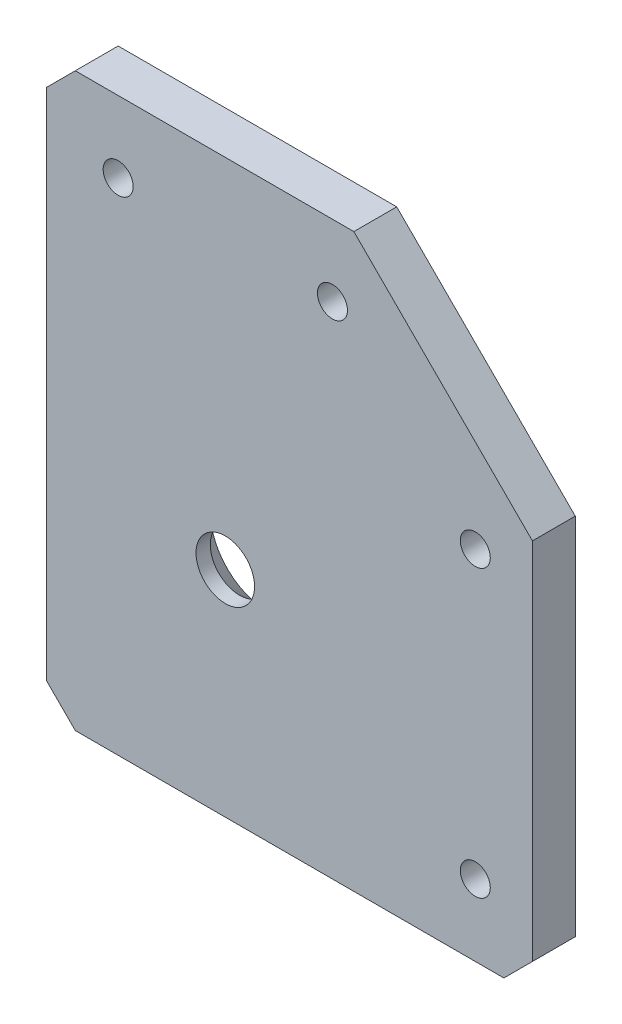
ISO-10303-21;
HEADER;
FILE_DESCRIPTION(('STEP AP214'),'2;1');
FILE_NAME('part.step','',(''),(''),'','','');
FILE_SCHEMA(('AUTOMOTIVE_DESIGN { 1 0 10303 214 1 1 1 1 }'));
ENDSEC;
DATA;
#1=APPLICATION_CONTEXT('core data for automotive mechanical design processes');
#2=APPLICATION_PROTOCOL_DEFINITION('international standard','automotive_design',2000,#1);
#3=PRODUCT_CONTEXT('',#1,'mechanical');
#4=PRODUCT('Part','Part','',(#3));
#5=PRODUCT_RELATED_PRODUCT_CATEGORY('part','',(#4));
#6=PRODUCT_DEFINITION_FORMATION('','',#4);
#7=PRODUCT_DEFINITION_CONTEXT('part definition',#1,'design');
#8=PRODUCT_DEFINITION('design','',#6,#7);
#9=PRODUCT_DEFINITION_SHAPE('','',#8);
#10=(LENGTH_UNIT() NAMED_UNIT(*) SI_UNIT(.MILLI.,.METRE.));
#11=(NAMED_UNIT(*) PLANE_ANGLE_UNIT() SI_UNIT($,.RADIAN.));
#12=(NAMED_UNIT(*) SI_UNIT($,.STERADIAN.) SOLID_ANGLE_UNIT());
#13=UNCERTAINTY_MEASURE_WITH_UNIT(LENGTH_MEASURE(1.E-05),#10,'distance_accuracy_value','');
#14=(GEOMETRIC_REPRESENTATION_CONTEXT(3) GLOBAL_UNCERTAINTY_ASSIGNED_CONTEXT((#13)) GLOBAL_UNIT_ASSIGNED_CONTEXT((#10,
#11,#12)) REPRESENTATION_CONTEXT('',''));
#15=CARTESIAN_POINT('',(0.,0.,0.));
#16=DIRECTION('',(0.,0.,1.));
#17=DIRECTION('',(1.,0.,0.));
#18=AXIS2_PLACEMENT_3D('',#15,#16,#17);
#19=CARTESIAN_POINT('',(0.,0.,3.));
#20=DIRECTION('',(0.,0.,1.));
#21=DIRECTION('',(1.,0.,0.));
#22=AXIS2_PLACEMENT_3D('',#19,#20,#21);
#23=PLANE('',#22);
#24=CARTESIAN_POINT('',(-15.,40.,3.));
#25=DIRECTION('',(0.,0.,1.));
#26=DIRECTION('',(1.,0.,0.));
#27=AXIS2_PLACEMENT_3D('',#24,#25,#26);
#28=CIRCLE('',#27,2.1);
#29=CARTESIAN_POINT('',(-12.9,40.,3.));
#30=VERTEX_POINT('',#29);
#31=EDGE_CURVE('E302',#30,#30,#28,.T.);
#32=ORIENTED_EDGE('',*,*,#31,.F.);
#33=EDGE_LOOP('',(#32));
#34=FACE_BOUND('',#33,.T.);
#35=CARTESIAN_POINT('',(35.,20.,3.));
#36=DIRECTION('',(0.,0.,1.));
#37=DIRECTION('',(1.,0.,0.));
#38=AXIS2_PLACEMENT_3D('',#35,#36,#37);
#39=CIRCLE('',#38,2.1);
#40=CARTESIAN_POINT('',(37.1,20.,3.));
#41=VERTEX_POINT('',#40);
#42=EDGE_CURVE('E294',#41,#41,#39,.T.);
#43=ORIENTED_EDGE('',*,*,#42,.F.);
#44=EDGE_LOOP('',(#43));
#45=FACE_BOUND('',#44,.T.);
#46=DIRECTION('',(-1.,0.,0.));
#47=VECTOR('',#46,1.);
#48=CARTESIAN_POINT('',(43.,50.,3.));
#49=LINE('',#48,#47);
#50=CARTESIAN_POINT('',(18.,50.,3.));
#51=VERTEX_POINT('',#50);
#52=CARTESIAN_POINT('',(-21.,50.,3.));
#53=VERTEX_POINT('',#52);
#54=EDGE_CURVE('E124',#51,#53,#49,.T.);
#55=ORIENTED_EDGE('',*,*,#54,.T.);
#56=DIRECTION('',(0.707106781186547,0.707106781186548,0.));
#57=VECTOR('',#56,1.);
#58=CARTESIAN_POINT('',(-35.5,35.5,3.));
#59=LINE('',#58,#57);
#60=CARTESIAN_POINT('',(-25.,46.,3.));
#61=VERTEX_POINT('',#60);
#62=EDGE_CURVE('E162',#53,#61,#59,.F.);
#63=ORIENTED_EDGE('',*,*,#62,.T.);
#64=DIRECTION('',(0.,-1.,0.));
#65=VECTOR('',#64,1.);
#66=CARTESIAN_POINT('',(-25.,-30.,3.));
#67=LINE('',#66,#65);
#68=CARTESIAN_POINT('',(-25.,-26.,3.));
#69=VERTEX_POINT('',#68);
#70=EDGE_CURVE('E129',#61,#69,#67,.T.);
#71=ORIENTED_EDGE('',*,*,#70,.T.);
#72=DIRECTION('',(-0.707106781186546,0.707106781186549,0.));
#73=VECTOR('',#72,1.);
#74=CARTESIAN_POINT('',(-25.5000000000001,-25.5,3.));
#75=LINE('',#74,#73);
#76=CARTESIAN_POINT('',(-21.,-30.,3.));
#77=VERTEX_POINT('',#76);
#78=EDGE_CURVE('E60',#69,#77,#75,.F.);
#79=ORIENTED_EDGE('',*,*,#78,.T.);
#80=DIRECTION('',(1.,0.,0.));
#81=VECTOR('',#80,1.);
#82=CARTESIAN_POINT('',(43.,-30.,3.));
#83=LINE('',#82,#81);
#84=CARTESIAN_POINT('',(39.,-30.,3.));
#85=VERTEX_POINT('',#84);
#86=EDGE_CURVE('E132',#77,#85,#83,.T.);
#87=ORIENTED_EDGE('',*,*,#86,.T.);
#88=DIRECTION('',(-0.70710678118655,-0.707106781186545,0.));
#89=VECTOR('',#88,1.);
#90=CARTESIAN_POINT('',(34.4999999999999,-34.5000000000001,3.));
#91=LINE('',#90,#89);
#92=CARTESIAN_POINT('',(43.,-26.,3.));
#93=VERTEX_POINT('',#92);
#94=EDGE_CURVE('E160',#85,#93,#91,.F.);
#95=ORIENTED_EDGE('',*,*,#94,.T.);
#96=DIRECTION('',(0.,1.,0.));
#97=VECTOR('',#96,1.);
#98=CARTESIAN_POINT('',(43.,-30.,3.));
#99=LINE('',#98,#97);
#100=CARTESIAN_POINT('',(43.,24.9999999999999,3.));
#101=VERTEX_POINT('',#100);
#102=EDGE_CURVE('E307',#93,#101,#99,.T.);
#103=ORIENTED_EDGE('',*,*,#102,.T.);
#104=DIRECTION('',(0.707106781186547,-0.707106781186548,0.));
#105=VECTOR('',#104,1.);
#106=CARTESIAN_POINT('',(34.,33.9999999999999,3.));
#107=LINE('',#106,#105);
#108=EDGE_CURVE('E139',#101,#51,#107,.F.);
#109=ORIENTED_EDGE('',*,*,#108,.T.);
#110=EDGE_LOOP('',(#55,#63,#71,#79,#87,#95,#103,#109));
#111=FACE_BOUND('',#110,.T.);
#112=CARTESIAN_POINT('',(0.,0.,3.));
#113=DIRECTION('',(0.,0.,1.));
#114=DIRECTION('',(1.,0.,0.));
#115=AXIS2_PLACEMENT_3D('',#112,#113,#114);
#116=CIRCLE('',#115,4.1);
#117=CARTESIAN_POINT('',(4.1,0.,3.));
#118=VERTEX_POINT('',#117);
#119=EDGE_CURVE('E295',#118,#118,#116,.T.);
#120=ORIENTED_EDGE('',*,*,#119,.F.);
#121=EDGE_LOOP('',(#120));
#122=FACE_BOUND('',#121,.T.);
#123=CARTESIAN_POINT('',(35.,-20.,3.));
#124=DIRECTION('',(0.,0.,1.));
#125=DIRECTION('',(1.,0.,0.));
#126=AXIS2_PLACEMENT_3D('',#123,#124,#125);
#127=CIRCLE('',#126,2.1);
#128=CARTESIAN_POINT('',(37.1,-20.,3.));
#129=VERTEX_POINT('',#128);
#130=EDGE_CURVE('E296',#129,#129,#127,.T.);
#131=ORIENTED_EDGE('',*,*,#130,.F.);
#132=EDGE_LOOP('',(#131));
#133=FACE_BOUND('',#132,.T.);
#134=CARTESIAN_POINT('',(15.,40.,3.));
#135=DIRECTION('',(0.,0.,1.));
#136=DIRECTION('',(1.,0.,0.));
#137=AXIS2_PLACEMENT_3D('',#134,#135,#136);
#138=CIRCLE('',#137,2.1);
#139=CARTESIAN_POINT('',(17.1,40.,3.));
#140=VERTEX_POINT('',#139);
#141=EDGE_CURVE('E449',#140,#140,#138,.T.);
#142=ORIENTED_EDGE('',*,*,#141,.F.);
#143=EDGE_LOOP('',(#142));
#144=FACE_BOUND('',#143,.T.);
#145=ADVANCED_FACE('F37',(#34,#45,#111,#122,#133,#144),#23,.T.);
#146=CARTESIAN_POINT('',(0.,0.,-3.));
#147=DIRECTION('',(0.,0.,1.));
#148=DIRECTION('',(1.,0.,0.));
#149=AXIS2_PLACEMENT_3D('',#146,#147,#148);
#150=PLANE('',#149);
#151=CARTESIAN_POINT('',(35.,-20.,-3.));
#152=DIRECTION('',(0.,0.,1.));
#153=DIRECTION('',(1.,0.,0.));
#154=AXIS2_PLACEMENT_3D('',#151,#152,#153);
#155=CIRCLE('',#154,4.09999999999998);
#156=CARTESIAN_POINT('',(39.1,-20.,-3.));
#157=VERTEX_POINT('',#156);
#158=EDGE_CURVE('E180',#157,#157,#155,.T.);
#159=ORIENTED_EDGE('',*,*,#158,.T.);
#160=EDGE_LOOP('',(#159));
#161=FACE_BOUND('',#160,.T.);
#162=CARTESIAN_POINT('',(35.,20.,-3.));
#163=DIRECTION('',(0.,0.,1.));
#164=DIRECTION('',(1.,0.,0.));
#165=AXIS2_PLACEMENT_3D('',#162,#163,#164);
#166=CIRCLE('',#165,4.09999999999998);
#167=CARTESIAN_POINT('',(39.1,20.,-3.));
#168=VERTEX_POINT('',#167);
#169=EDGE_CURVE('E177',#168,#168,#166,.T.);
#170=ORIENTED_EDGE('',*,*,#169,.T.);
#171=EDGE_LOOP('',(#170));
#172=FACE_BOUND('',#171,.T.);
#173=CARTESIAN_POINT('',(15.,40.,-3.));
#174=DIRECTION('',(0.,0.,1.));
#175=DIRECTION('',(1.,0.,0.));
#176=AXIS2_PLACEMENT_3D('',#173,#174,#175);
#177=CIRCLE('',#176,4.09999999999998);
#178=CARTESIAN_POINT('',(19.1,40.,-3.));
#179=VERTEX_POINT('',#178);
#180=EDGE_CURVE('E174',#179,#179,#177,.T.);
#181=ORIENTED_EDGE('',*,*,#180,.T.);
#182=EDGE_LOOP('',(#181));
#183=FACE_BOUND('',#182,.T.);
#184=CARTESIAN_POINT('',(-15.,40.,-3.));
#185=DIRECTION('',(0.,0.,1.));
#186=DIRECTION('',(1.,0.,0.));
#187=AXIS2_PLACEMENT_3D('',#184,#185,#186);
#188=CIRCLE('',#187,4.09999999999998);
#189=CARTESIAN_POINT('',(-10.9,40.,-3.));
#190=VERTEX_POINT('',#189);
#191=EDGE_CURVE('E171',#190,#190,#188,.T.);
#192=ORIENTED_EDGE('',*,*,#191,.T.);
#193=EDGE_LOOP('',(#192));
#194=FACE_BOUND('',#193,.T.);
#195=CARTESIAN_POINT('',(0.,0.,-3.));
#196=DIRECTION('',(0.,0.,1.));
#197=DIRECTION('',(1.,0.,0.));
#198=AXIS2_PLACEMENT_3D('',#195,#196,#197);
#199=CIRCLE('',#198,8.1);
#200=CARTESIAN_POINT('',(8.1,0.,-3.));
#201=VERTEX_POINT('',#200);
#202=EDGE_CURVE('E146',#201,#201,#199,.T.);
#203=ORIENTED_EDGE('',*,*,#202,.T.);
#204=EDGE_LOOP('',(#203));
#205=FACE_BOUND('',#204,.T.);
#206=DIRECTION('',(0.,-1.,0.));
#207=VECTOR('',#206,1.);
#208=CARTESIAN_POINT('',(-25.,-30.,-3.));
#209=LINE('',#208,#207);
#210=CARTESIAN_POINT('',(-25.,46.,-3.));
#211=VERTEX_POINT('',#210);
#212=CARTESIAN_POINT('',(-25.,-26.,-3.));
#213=VERTEX_POINT('',#212);
#214=EDGE_CURVE('E299',#211,#213,#209,.T.);
#215=ORIENTED_EDGE('',*,*,#214,.F.);
#216=DIRECTION('',(-0.707106781186547,-0.707106781186548,0.));
#217=VECTOR('',#216,1.);
#218=CARTESIAN_POINT('',(-25.,46.,-3.));
#219=LINE('',#218,#217);
#220=CARTESIAN_POINT('',(-21.,50.,-3.));
#221=VERTEX_POINT('',#220);
#222=EDGE_CURVE('E128',#211,#221,#219,.F.);
#223=ORIENTED_EDGE('',*,*,#222,.T.);
#224=DIRECTION('',(-1.,0.,0.));
#225=VECTOR('',#224,1.);
#226=CARTESIAN_POINT('',(43.,50.,-3.));
#227=LINE('',#226,#225);
#228=CARTESIAN_POINT('',(18.,50.,-3.));
#229=VERTEX_POINT('',#228);
#230=EDGE_CURVE('E121',#229,#221,#227,.T.);
#231=ORIENTED_EDGE('',*,*,#230,.F.);
#232=DIRECTION('',(-0.707106781186547,0.707106781186548,0.));
#233=VECTOR('',#232,1.);
#234=CARTESIAN_POINT('',(18.,50.,-3.));
#235=LINE('',#234,#233);
#236=CARTESIAN_POINT('',(43.,24.9999999999999,-3.));
#237=VERTEX_POINT('',#236);
#238=EDGE_CURVE('E106',#229,#237,#235,.F.);
#239=ORIENTED_EDGE('',*,*,#238,.T.);
#240=DIRECTION('',(0.,1.,0.));
#241=VECTOR('',#240,1.);
#242=CARTESIAN_POINT('',(43.,-30.,-3.));
#243=LINE('',#242,#241);
#244=CARTESIAN_POINT('',(43.,-26.,-3.));
#245=VERTEX_POINT('',#244);
#246=EDGE_CURVE('E130',#245,#237,#243,.T.);
#247=ORIENTED_EDGE('',*,*,#246,.F.);
#248=DIRECTION('',(0.70710678118655,0.707106781186545,0.));
#249=VECTOR('',#248,1.);
#250=CARTESIAN_POINT('',(43.,-26.,-3.));
#251=LINE('',#250,#249);
#252=CARTESIAN_POINT('',(39.,-30.,-3.));
#253=VERTEX_POINT('',#252);
#254=EDGE_CURVE('E143',#245,#253,#251,.F.);
#255=ORIENTED_EDGE('',*,*,#254,.T.);
#256=DIRECTION('',(1.,0.,0.));
#257=VECTOR('',#256,1.);
#258=CARTESIAN_POINT('',(43.,-30.,-3.));
#259=LINE('',#258,#257);
#260=CARTESIAN_POINT('',(-21.,-30.,-3.));
#261=VERTEX_POINT('',#260);
#262=EDGE_CURVE('E134',#261,#253,#259,.T.);
#263=ORIENTED_EDGE('',*,*,#262,.F.);
#264=DIRECTION('',(0.707106781186546,-0.707106781186549,0.));
#265=VECTOR('',#264,1.);
#266=CARTESIAN_POINT('',(-21.,-30.,-3.));
#267=LINE('',#266,#265);
#268=EDGE_CURVE('E141',#261,#213,#267,.F.);
#269=ORIENTED_EDGE('',*,*,#268,.T.);
#270=EDGE_LOOP('',(#215,#223,#231,#239,#247,#255,#263,#269));
#271=FACE_BOUND('',#270,.T.);
#272=ADVANCED_FACE('F127',(#161,#172,#183,#194,#205,#271),#150,.F.);
#273=CARTESIAN_POINT('',(-25.,-30.,3.));
#274=DIRECTION('',(1.,0.,0.));
#275=DIRECTION('',(0.,1.,0.));
#276=AXIS2_PLACEMENT_3D('',#273,#274,#275);
#277=PLANE('',#276);
#278=ORIENTED_EDGE('',*,*,#70,.F.);
#279=DIRECTION('',(0.,0.,-1.));
#280=VECTOR('',#279,1.);
#281=CARTESIAN_POINT('',(-25.,46.,3.));
#282=LINE('',#281,#280);
#283=EDGE_CURVE('E154',#61,#211,#282,.T.);
#284=ORIENTED_EDGE('',*,*,#283,.T.);
#285=ORIENTED_EDGE('',*,*,#214,.T.);
#286=DIRECTION('',(0.,0.,1.));
#287=VECTOR('',#286,1.);
#288=CARTESIAN_POINT('',(-25.,-26.,3.));
#289=LINE('',#288,#287);
#290=EDGE_CURVE('E152',#213,#69,#289,.T.);
#291=ORIENTED_EDGE('',*,*,#290,.T.);
#292=EDGE_LOOP('',(#278,#284,#285,#291));
#293=FACE_BOUND('',#292,.T.);
#294=ADVANCED_FACE('F202',(#293),#277,.F.);
#295=CARTESIAN_POINT('',(43.,-30.,3.));
#296=DIRECTION('',(0.,1.,0.));
#297=DIRECTION('',(-1.,0.,0.));
#298=AXIS2_PLACEMENT_3D('',#295,#296,#297);
#299=PLANE('',#298);
#300=ORIENTED_EDGE('',*,*,#262,.T.);
#301=DIRECTION('',(0.,0.,1.));
#302=VECTOR('',#301,1.);
#303=CARTESIAN_POINT('',(39.,-30.,3.));
#304=LINE('',#303,#302);
#305=EDGE_CURVE('E53',#253,#85,#304,.T.);
#306=ORIENTED_EDGE('',*,*,#305,.T.);
#307=ORIENTED_EDGE('',*,*,#86,.F.);
#308=DIRECTION('',(0.,0.,-1.));
#309=VECTOR('',#308,1.);
#310=CARTESIAN_POINT('',(-21.,-30.,3.));
#311=LINE('',#310,#309);
#312=EDGE_CURVE('E167',#77,#261,#311,.T.);
#313=ORIENTED_EDGE('',*,*,#312,.T.);
#314=EDGE_LOOP('',(#300,#306,#307,#313));
#315=FACE_BOUND('',#314,.T.);
#316=ADVANCED_FACE('F240',(#315),#299,.F.);
#317=CARTESIAN_POINT('',(43.,-30.,3.));
#318=DIRECTION('',(-1.,0.,0.));
#319=DIRECTION('',(0.,-1.,0.));
#320=AXIS2_PLACEMENT_3D('',#317,#318,#319);
#321=PLANE('',#320);
#322=ORIENTED_EDGE('',*,*,#102,.F.);
#323=DIRECTION('',(0.,0.,-1.));
#324=VECTOR('',#323,1.);
#325=CARTESIAN_POINT('',(43.,-26.,3.));
#326=LINE('',#325,#324);
#327=EDGE_CURVE('E164',#93,#245,#326,.T.);
#328=ORIENTED_EDGE('',*,*,#327,.T.);
#329=ORIENTED_EDGE('',*,*,#246,.T.);
#330=DIRECTION('',(0.,0.,1.));
#331=VECTOR('',#330,1.);
#332=CARTESIAN_POINT('',(43.,24.9999999999999,3.));
#333=LINE('',#332,#331);
#334=EDGE_CURVE('E112',#237,#101,#333,.T.);
#335=ORIENTED_EDGE('',*,*,#334,.T.);
#336=EDGE_LOOP('',(#322,#328,#329,#335));
#337=FACE_BOUND('',#336,.T.);
#338=ADVANCED_FACE('F237',(#337),#321,.F.);
#339=CARTESIAN_POINT('',(43.,50.,3.));
#340=DIRECTION('',(0.,-1.,0.));
#341=DIRECTION('',(1.,0.,0.));
#342=AXIS2_PLACEMENT_3D('',#339,#340,#341);
#343=PLANE('',#342);
#344=ORIENTED_EDGE('',*,*,#230,.T.);
#345=DIRECTION('',(0.,0.,1.));
#346=VECTOR('',#345,1.);
#347=CARTESIAN_POINT('',(-21.,50.,3.));
#348=LINE('',#347,#346);
#349=EDGE_CURVE('E157',#221,#53,#348,.T.);
#350=ORIENTED_EDGE('',*,*,#349,.T.);
#351=ORIENTED_EDGE('',*,*,#54,.F.);
#352=DIRECTION('',(0.,0.,-1.));
#353=VECTOR('',#352,1.);
#354=CARTESIAN_POINT('',(18.,50.,3.));
#355=LINE('',#354,#353);
#356=EDGE_CURVE('E110',#51,#229,#355,.T.);
#357=ORIENTED_EDGE('',*,*,#356,.T.);
#358=EDGE_LOOP('',(#344,#350,#351,#357));
#359=FACE_BOUND('',#358,.T.);
#360=ADVANCED_FACE('F120',(#359),#343,.F.);
#361=CARTESIAN_POINT('',(0.,0.,3.));
#362=DIRECTION('',(0.,0.,-1.));
#363=DIRECTION('',(-1.,0.,0.));
#364=AXIS2_PLACEMENT_3D('',#361,#362,#363);
#365=CYLINDRICAL_SURFACE('',#364,4.1);
#366=CARTESIAN_POINT('',(0.,0.,1.00000000000001));
#367=DIRECTION('',(0.,0.,1.));
#368=DIRECTION('',(1.,0.,0.));
#369=AXIS2_PLACEMENT_3D('',#366,#367,#368);
#370=CIRCLE('',#369,4.1);
#371=CARTESIAN_POINT('',(4.1,0.,1.00000000000001));
#372=VERTEX_POINT('',#371);
#373=EDGE_CURVE('E149',#372,#372,#370,.F.);
#374=ORIENTED_EDGE('',*,*,#373,.T.);
#375=EDGE_LOOP('',(#374));
#376=FACE_BOUND('',#375,.T.);
#377=ORIENTED_EDGE('',*,*,#119,.T.);
#378=EDGE_LOOP('',(#377));
#379=FACE_BOUND('',#378,.T.);
#380=ADVANCED_FACE('F232',(#376,#379),#365,.F.);
#381=CARTESIAN_POINT('',(35.,20.,3.));
#382=DIRECTION('',(0.,0.,-1.));
#383=DIRECTION('',(-1.,0.,0.));
#384=AXIS2_PLACEMENT_3D('',#381,#382,#383);
#385=CYLINDRICAL_SURFACE('',#384,2.1);
#386=CARTESIAN_POINT('',(35.,20.,-1.00000000000001));
#387=DIRECTION('',(0.,0.,1.));
#388=DIRECTION('',(1.,0.,0.));
#389=AXIS2_PLACEMENT_3D('',#386,#387,#388);
#390=CIRCLE('',#389,2.1);
#391=CARTESIAN_POINT('',(37.1,20.,-1.00000000000001));
#392=VERTEX_POINT('',#391);
#393=EDGE_CURVE('E186',#392,#392,#390,.F.);
#394=ORIENTED_EDGE('',*,*,#393,.T.);
#395=EDGE_LOOP('',(#394));
#396=FACE_BOUND('',#395,.T.);
#397=ORIENTED_EDGE('',*,*,#42,.T.);
#398=EDGE_LOOP('',(#397));
#399=FACE_BOUND('',#398,.T.);
#400=ADVANCED_FACE('F288',(#396,#399),#385,.F.);
#401=CARTESIAN_POINT('',(35.,-20.,3.));
#402=DIRECTION('',(0.,0.,-1.));
#403=DIRECTION('',(-1.,0.,0.));
#404=AXIS2_PLACEMENT_3D('',#401,#402,#403);
#405=CYLINDRICAL_SURFACE('',#404,2.1);
#406=CARTESIAN_POINT('',(35.,-20.,-1.00000000000001));
#407=DIRECTION('',(0.,0.,1.));
#408=DIRECTION('',(1.,0.,0.));
#409=AXIS2_PLACEMENT_3D('',#406,#407,#408);
#410=CIRCLE('',#409,2.1);
#411=CARTESIAN_POINT('',(37.1,-20.,-1.00000000000001));
#412=VERTEX_POINT('',#411);
#413=EDGE_CURVE('E183',#412,#412,#410,.F.);
#414=ORIENTED_EDGE('',*,*,#413,.T.);
#415=EDGE_LOOP('',(#414));
#416=FACE_BOUND('',#415,.T.);
#417=ORIENTED_EDGE('',*,*,#130,.T.);
#418=EDGE_LOOP('',(#417));
#419=FACE_BOUND('',#418,.T.);
#420=ADVANCED_FACE('F291',(#416,#419),#405,.F.);
#421=CARTESIAN_POINT('',(-15.,40.,3.));
#422=DIRECTION('',(0.,0.,-1.));
#423=DIRECTION('',(-1.,0.,0.));
#424=AXIS2_PLACEMENT_3D('',#421,#422,#423);
#425=CYLINDRICAL_SURFACE('',#424,2.1);
#426=CARTESIAN_POINT('',(-15.,40.,-1.00000000000001));
#427=DIRECTION('',(0.,0.,1.));
#428=DIRECTION('',(1.,0.,0.));
#429=AXIS2_PLACEMENT_3D('',#426,#427,#428);
#430=CIRCLE('',#429,2.1);
#431=CARTESIAN_POINT('',(-12.9,40.,-1.00000000000001));
#432=VERTEX_POINT('',#431);
#433=EDGE_CURVE('E11',#432,#432,#430,.F.);
#434=ORIENTED_EDGE('',*,*,#433,.T.);
#435=EDGE_LOOP('',(#434));
#436=FACE_BOUND('',#435,.T.);
#437=ORIENTED_EDGE('',*,*,#31,.T.);
#438=EDGE_LOOP('',(#437));
#439=FACE_BOUND('',#438,.T.);
#440=ADVANCED_FACE('F390',(#436,#439),#425,.F.);
#441=CARTESIAN_POINT('',(15.,40.,3.));
#442=DIRECTION('',(0.,0.,-1.));
#443=DIRECTION('',(-1.,0.,0.));
#444=AXIS2_PLACEMENT_3D('',#441,#442,#443);
#445=CYLINDRICAL_SURFACE('',#444,2.1);
#446=CARTESIAN_POINT('',(15.,40.,-1.00000000000001));
#447=DIRECTION('',(0.,0.,1.));
#448=DIRECTION('',(1.,0.,0.));
#449=AXIS2_PLACEMENT_3D('',#446,#447,#448);
#450=CIRCLE('',#449,2.1);
#451=CARTESIAN_POINT('',(17.1,40.,-1.00000000000001));
#452=VERTEX_POINT('',#451);
#453=EDGE_CURVE('E46',#452,#452,#450,.F.);
#454=ORIENTED_EDGE('',*,*,#453,.T.);
#455=EDGE_LOOP('',(#454));
#456=FACE_BOUND('',#455,.T.);
#457=ORIENTED_EDGE('',*,*,#141,.T.);
#458=EDGE_LOOP('',(#457));
#459=FACE_BOUND('',#458,.T.);
#460=ADVANCED_FACE('F191',(#456,#459),#445,.F.);
#461=CARTESIAN_POINT('',(18.,50.,3.));
#462=DIRECTION('',(-0.707106781186548,-0.707106781186547,0.));
#463=DIRECTION('',(0.,0.,-1.));
#464=AXIS2_PLACEMENT_3D('',#461,#462,#463);
#465=PLANE('',#464);
#466=ORIENTED_EDGE('',*,*,#108,.F.);
#467=ORIENTED_EDGE('',*,*,#334,.F.);
#468=ORIENTED_EDGE('',*,*,#238,.F.);
#469=ORIENTED_EDGE('',*,*,#356,.F.);
#470=EDGE_LOOP('',(#466,#467,#468,#469));
#471=FACE_BOUND('',#470,.T.);
#472=ADVANCED_FACE('F109',(#471),#465,.F.);
#473=CARTESIAN_POINT('',(0.,0.,-3.));
#474=DIRECTION('',(0.,0.,-1.));
#475=DIRECTION('',(-1.,0.,0.));
#476=AXIS2_PLACEMENT_3D('',#473,#474,#475);
#477=CONICAL_SURFACE('',#476,8.1,0.785398163397447);
#478=ORIENTED_EDGE('',*,*,#373,.F.);
#479=EDGE_LOOP('',(#478));
#480=FACE_BOUND('',#479,.T.);
#481=ORIENTED_EDGE('',*,*,#202,.F.);
#482=EDGE_LOOP('',(#481));
#483=FACE_BOUND('',#482,.T.);
#484=ADVANCED_FACE('F209',(#480,#483),#477,.F.);
#485=CARTESIAN_POINT('',(-25.,46.,3.));
#486=DIRECTION('',(0.707106781186548,-0.707106781186547,0.));
#487=DIRECTION('',(0.,0.,-1.));
#488=AXIS2_PLACEMENT_3D('',#485,#486,#487);
#489=PLANE('',#488);
#490=ORIENTED_EDGE('',*,*,#62,.F.);
#491=ORIENTED_EDGE('',*,*,#349,.F.);
#492=ORIENTED_EDGE('',*,*,#222,.F.);
#493=ORIENTED_EDGE('',*,*,#283,.F.);
#494=EDGE_LOOP('',(#490,#491,#492,#493));
#495=FACE_BOUND('',#494,.T.);
#496=ADVANCED_FACE('F211',(#495),#489,.F.);
#497=CARTESIAN_POINT('',(43.,-26.,3.));
#498=DIRECTION('',(-0.707106781186545,0.70710678118655,0.));
#499=DIRECTION('',(0.,0.,-1.));
#500=AXIS2_PLACEMENT_3D('',#497,#498,#499);
#501=PLANE('',#500);
#502=ORIENTED_EDGE('',*,*,#94,.F.);
#503=ORIENTED_EDGE('',*,*,#305,.F.);
#504=ORIENTED_EDGE('',*,*,#254,.F.);
#505=ORIENTED_EDGE('',*,*,#327,.F.);
#506=EDGE_LOOP('',(#502,#503,#504,#505));
#507=FACE_BOUND('',#506,.T.);
#508=ADVANCED_FACE('F218',(#507),#501,.F.);
#509=CARTESIAN_POINT('',(-21.,-30.,3.));
#510=DIRECTION('',(0.707106781186549,0.707106781186546,0.));
#511=DIRECTION('',(0.,0.,-1.));
#512=AXIS2_PLACEMENT_3D('',#509,#510,#511);
#513=PLANE('',#512);
#514=ORIENTED_EDGE('',*,*,#78,.F.);
#515=ORIENTED_EDGE('',*,*,#290,.F.);
#516=ORIENTED_EDGE('',*,*,#268,.F.);
#517=ORIENTED_EDGE('',*,*,#312,.F.);
#518=EDGE_LOOP('',(#514,#515,#516,#517));
#519=FACE_BOUND('',#518,.T.);
#520=ADVANCED_FACE('F263',(#519),#513,.F.);
#521=CARTESIAN_POINT('',(35.,-20.,-3.));
#522=DIRECTION('',(0.,0.,-1.));
#523=DIRECTION('',(-1.,0.,0.));
#524=AXIS2_PLACEMENT_3D('',#521,#522,#523);
#525=CONICAL_SURFACE('',#524,4.09999999999998,0.785398163397447);
#526=ORIENTED_EDGE('',*,*,#413,.F.);
#527=EDGE_LOOP('',(#526));
#528=FACE_BOUND('',#527,.T.);
#529=ORIENTED_EDGE('',*,*,#158,.F.);
#530=EDGE_LOOP('',(#529));
#531=FACE_BOUND('',#530,.T.);
#532=ADVANCED_FACE('F268',(#528,#531),#525,.F.);
#533=CARTESIAN_POINT('',(35.,20.,-3.));
#534=DIRECTION('',(0.,0.,-1.));
#535=DIRECTION('',(-1.,0.,0.));
#536=AXIS2_PLACEMENT_3D('',#533,#534,#535);
#537=CONICAL_SURFACE('',#536,4.09999999999998,0.785398163397447);
#538=ORIENTED_EDGE('',*,*,#393,.F.);
#539=EDGE_LOOP('',(#538));
#540=FACE_BOUND('',#539,.T.);
#541=ORIENTED_EDGE('',*,*,#169,.F.);
#542=EDGE_LOOP('',(#541));
#543=FACE_BOUND('',#542,.T.);
#544=ADVANCED_FACE('F197',(#540,#543),#537,.F.);
#545=CARTESIAN_POINT('',(15.,40.,-3.));
#546=DIRECTION('',(0.,0.,-1.));
#547=DIRECTION('',(-1.,0.,0.));
#548=AXIS2_PLACEMENT_3D('',#545,#546,#547);
#549=CONICAL_SURFACE('',#548,4.09999999999998,0.785398163397447);
#550=ORIENTED_EDGE('',*,*,#453,.F.);
#551=EDGE_LOOP('',(#550));
#552=FACE_BOUND('',#551,.T.);
#553=ORIENTED_EDGE('',*,*,#180,.F.);
#554=EDGE_LOOP('',(#553));
#555=FACE_BOUND('',#554,.T.);
#556=ADVANCED_FACE('F194',(#552,#555),#549,.F.);
#557=CARTESIAN_POINT('',(-15.,40.,-3.));
#558=DIRECTION('',(0.,0.,-1.));
#559=DIRECTION('',(-1.,0.,0.));
#560=AXIS2_PLACEMENT_3D('',#557,#558,#559);
#561=CONICAL_SURFACE('',#560,4.09999999999998,0.785398163397446);
#562=ORIENTED_EDGE('',*,*,#433,.F.);
#563=EDGE_LOOP('',(#562));
#564=FACE_BOUND('',#563,.T.);
#565=ORIENTED_EDGE('',*,*,#191,.F.);
#566=EDGE_LOOP('',(#565));
#567=FACE_BOUND('',#566,.T.);
#568=ADVANCED_FACE('F40',(#564,#567),#561,.F.);
#569=CLOSED_SHELL('',(#145,#272,#294,#316,#338,#360,#380,#400,#420,#440,#460,#472,#484,#496,
#508,#520,#532,#544,#556,#568));
#570=MANIFOLD_SOLID_BREP('B2',#569);
#571=ADVANCED_BREP_SHAPE_REPRESENTATION('',(#18,#570),#14);
#572=SHAPE_DEFINITION_REPRESENTATION(#9,#571);
ENDSEC;
END-ISO-10303-21;
